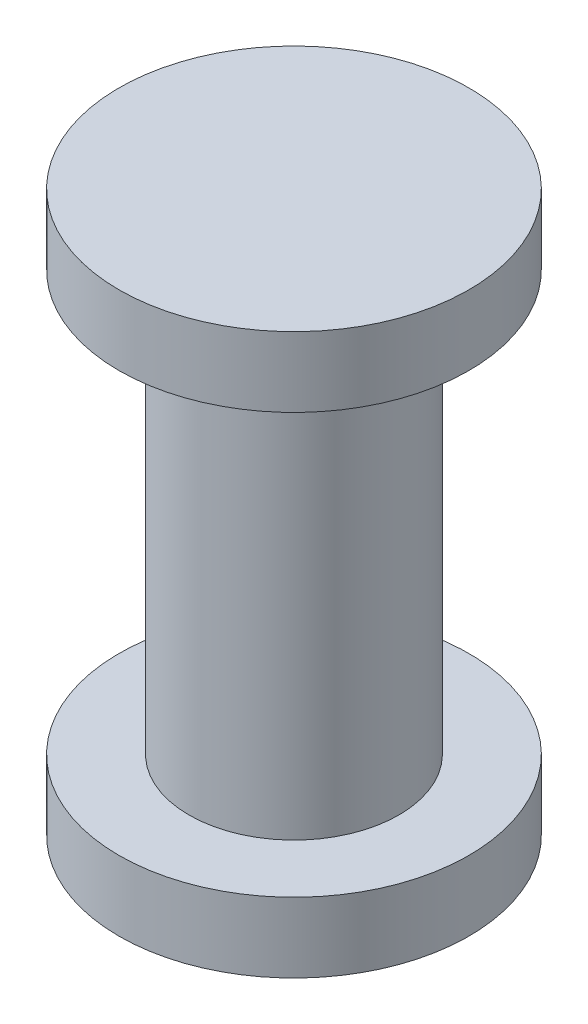
ISO-10303-21;
HEADER;
FILE_DESCRIPTION(('STEP AP214'),'2;1');
FILE_NAME('part.step','',(''),(''),'','','');
FILE_SCHEMA(('AUTOMOTIVE_DESIGN { 1 0 10303 214 1 1 1 1 }'));
ENDSEC;
DATA;
#1=APPLICATION_CONTEXT('core data for automotive mechanical design processes');
#2=APPLICATION_PROTOCOL_DEFINITION('international standard','automotive_design',2000,#1);
#3=PRODUCT_CONTEXT('',#1,'mechanical');
#4=PRODUCT('Part','Part','',(#3));
#5=PRODUCT_RELATED_PRODUCT_CATEGORY('part','',(#4));
#6=PRODUCT_DEFINITION_FORMATION('','',#4);
#7=PRODUCT_DEFINITION_CONTEXT('part definition',#1,'design');
#8=PRODUCT_DEFINITION('design','',#6,#7);
#9=PRODUCT_DEFINITION_SHAPE('','',#8);
#10=(LENGTH_UNIT() NAMED_UNIT(*) SI_UNIT(.MILLI.,.METRE.));
#11=(NAMED_UNIT(*) PLANE_ANGLE_UNIT() SI_UNIT($,.RADIAN.));
#12=(NAMED_UNIT(*) SI_UNIT($,.STERADIAN.) SOLID_ANGLE_UNIT());
#13=UNCERTAINTY_MEASURE_WITH_UNIT(LENGTH_MEASURE(1.E-05),#10,'distance_accuracy_value','');
#14=(GEOMETRIC_REPRESENTATION_CONTEXT(3) GLOBAL_UNCERTAINTY_ASSIGNED_CONTEXT((#13)) GLOBAL_UNIT_ASSIGNED_CONTEXT((#10,
#11,#12)) REPRESENTATION_CONTEXT('',''));
#15=CARTESIAN_POINT('',(0.,0.,0.));
#16=DIRECTION('',(0.,0.,1.));
#17=DIRECTION('',(1.,0.,0.));
#18=AXIS2_PLACEMENT_3D('',#15,#16,#17);
#19=CARTESIAN_POINT('',(-14.7615435905984,19.9486383621148,0.));
#20=DIRECTION('',(0.,-1.,0.));
#21=DIRECTION('',(0.,0.,-1.));
#22=AXIS2_PLACEMENT_3D('',#19,#20,#21);
#23=PLANE('',#22);
#24=CARTESIAN_POINT('',(-14.7615435905984,19.9486383621148,0.));
#25=DIRECTION('',(0.,1.,0.));
#26=DIRECTION('',(0.,0.,1.));
#27=AXIS2_PLACEMENT_3D('',#24,#25,#26);
#28=CIRCLE('',#27,2.5);
#29=CARTESIAN_POINT('',(-14.7615435905984,19.9486383621148,2.5));
#30=VERTEX_POINT('',#29);
#31=EDGE_CURVE('E10',#30,#30,#28,.T.);
#32=ORIENTED_EDGE('',*,*,#31,.F.);
#33=EDGE_LOOP('',(#32));
#34=FACE_BOUND('',#33,.T.);
#35=ADVANCED_FACE('F41',(#34),#23,.T.);
#36=CARTESIAN_POINT('',(-14.7615435905984,27.9486383621148,0.));
#37=DIRECTION('',(0.,1.,0.));
#38=DIRECTION('',(0.,0.,1.));
#39=AXIS2_PLACEMENT_3D('',#36,#37,#38);
#40=CYLINDRICAL_SURFACE('',#39,2.5);
#41=ORIENTED_EDGE('',*,*,#31,.T.);
#42=EDGE_LOOP('',(#41));
#43=FACE_BOUND('',#42,.T.);
#44=CARTESIAN_POINT('',(-14.7615435905984,20.9486383621148,0.));
#45=DIRECTION('',(0.,1.,0.));
#46=DIRECTION('',(0.,0.,1.));
#47=AXIS2_PLACEMENT_3D('',#44,#45,#46);
#48=CIRCLE('',#47,2.5);
#49=CARTESIAN_POINT('',(-14.7615435905984,20.9486383621148,2.5));
#50=VERTEX_POINT('',#49);
#51=EDGE_CURVE('E48',#50,#50,#48,.T.);
#52=ORIENTED_EDGE('',*,*,#51,.F.);
#53=EDGE_LOOP('',(#52));
#54=FACE_BOUND('',#53,.T.);
#55=ADVANCED_FACE('F89',(#43,#54),#40,.T.);
#56=CARTESIAN_POINT('',(-17.2615435905984,20.9486383621148,0.));
#57=DIRECTION('',(0.,1.,0.));
#58=DIRECTION('',(0.,0.,1.));
#59=AXIS2_PLACEMENT_3D('',#56,#57,#58);
#60=PLANE('',#59);
#61=ORIENTED_EDGE('',*,*,#51,.T.);
#62=EDGE_LOOP('',(#61));
#63=FACE_BOUND('',#62,.T.);
#64=CARTESIAN_POINT('',(-14.7615435905984,20.9486383621148,0.));
#65=DIRECTION('',(0.,1.,0.));
#66=DIRECTION('',(0.,0.,1.));
#67=AXIS2_PLACEMENT_3D('',#64,#65,#66);
#68=CIRCLE('',#67,1.5);
#69=CARTESIAN_POINT('',(-14.7615435905984,20.9486383621148,1.5));
#70=VERTEX_POINT('',#69);
#71=EDGE_CURVE('E53',#70,#70,#68,.T.);
#72=ORIENTED_EDGE('',*,*,#71,.F.);
#73=EDGE_LOOP('',(#72));
#74=FACE_BOUND('',#73,.T.);
#75=ADVANCED_FACE('F94',(#63,#74),#60,.T.);
#76=CARTESIAN_POINT('',(-14.7615435905984,27.9486383621148,0.));
#77=DIRECTION('',(0.,1.,0.));
#78=DIRECTION('',(0.,0.,1.));
#79=AXIS2_PLACEMENT_3D('',#76,#77,#78);
#80=CYLINDRICAL_SURFACE('',#79,1.5);
#81=ORIENTED_EDGE('',*,*,#71,.T.);
#82=EDGE_LOOP('',(#81));
#83=FACE_BOUND('',#82,.T.);
#84=CARTESIAN_POINT('',(-14.7615435905984,26.9486383621148,0.));
#85=DIRECTION('',(0.,1.,0.));
#86=DIRECTION('',(0.,0.,1.));
#87=AXIS2_PLACEMENT_3D('',#84,#85,#86);
#88=CIRCLE('',#87,1.5);
#89=CARTESIAN_POINT('',(-14.7615435905984,26.9486383621148,1.5));
#90=VERTEX_POINT('',#89);
#91=EDGE_CURVE('E58',#90,#90,#88,.T.);
#92=ORIENTED_EDGE('',*,*,#91,.F.);
#93=EDGE_LOOP('',(#92));
#94=FACE_BOUND('',#93,.T.);
#95=ADVANCED_FACE('F85',(#83,#94),#80,.T.);
#96=CARTESIAN_POINT('',(-16.2615435905984,26.9486383621148,0.));
#97=DIRECTION('',(0.,-1.,0.));
#98=DIRECTION('',(0.,0.,-1.));
#99=AXIS2_PLACEMENT_3D('',#96,#97,#98);
#100=PLANE('',#99);
#101=ORIENTED_EDGE('',*,*,#91,.T.);
#102=EDGE_LOOP('',(#101));
#103=FACE_BOUND('',#102,.T.);
#104=CARTESIAN_POINT('',(-14.7615435905984,26.9486383621148,0.));
#105=DIRECTION('',(0.,1.,0.));
#106=DIRECTION('',(0.,0.,1.));
#107=AXIS2_PLACEMENT_3D('',#104,#105,#106);
#108=CIRCLE('',#107,2.5);
#109=CARTESIAN_POINT('',(-14.7615435905984,26.9486383621148,2.5));
#110=VERTEX_POINT('',#109);
#111=EDGE_CURVE('E64',#110,#110,#108,.T.);
#112=ORIENTED_EDGE('',*,*,#111,.F.);
#113=EDGE_LOOP('',(#112));
#114=FACE_BOUND('',#113,.T.);
#115=ADVANCED_FACE('F77',(#103,#114),#100,.T.);
#116=CARTESIAN_POINT('',(-14.7615435905984,27.9486383621148,0.));
#117=DIRECTION('',(0.,1.,0.));
#118=DIRECTION('',(0.,0.,1.));
#119=AXIS2_PLACEMENT_3D('',#116,#117,#118);
#120=CYLINDRICAL_SURFACE('',#119,2.5);
#121=ORIENTED_EDGE('',*,*,#111,.T.);
#122=EDGE_LOOP('',(#121));
#123=FACE_BOUND('',#122,.T.);
#124=CARTESIAN_POINT('',(-14.7615435905984,27.9486383621148,0.));
#125=DIRECTION('',(0.,1.,0.));
#126=DIRECTION('',(0.,0.,1.));
#127=AXIS2_PLACEMENT_3D('',#124,#125,#126);
#128=CIRCLE('',#127,2.5);
#129=CARTESIAN_POINT('',(-14.7615435905984,27.9486383621148,2.5));
#130=VERTEX_POINT('',#129);
#131=EDGE_CURVE('E68',#130,#130,#128,.T.);
#132=ORIENTED_EDGE('',*,*,#131,.F.);
#133=EDGE_LOOP('',(#132));
#134=FACE_BOUND('',#133,.T.);
#135=ADVANCED_FACE('F75',(#123,#134),#120,.T.);
#136=CARTESIAN_POINT('',(-14.7615435905984,27.9486383621148,0.));
#137=DIRECTION('',(0.,1.,0.));
#138=DIRECTION('',(0.,0.,1.));
#139=AXIS2_PLACEMENT_3D('',#136,#137,#138);
#140=PLANE('',#139);
#141=ORIENTED_EDGE('',*,*,#131,.T.);
#142=EDGE_LOOP('',(#141));
#143=FACE_BOUND('',#142,.T.);
#144=ADVANCED_FACE('F73',(#143),#140,.T.);
#145=CLOSED_SHELL('',(#35,#55,#75,#95,#115,#135,#144));
#146=MANIFOLD_SOLID_BREP('B2',#145);
#147=ADVANCED_BREP_SHAPE_REPRESENTATION('',(#18,#146),#14);
#148=SHAPE_DEFINITION_REPRESENTATION(#9,#147);
ENDSEC;
END-ISO-10303-21;
